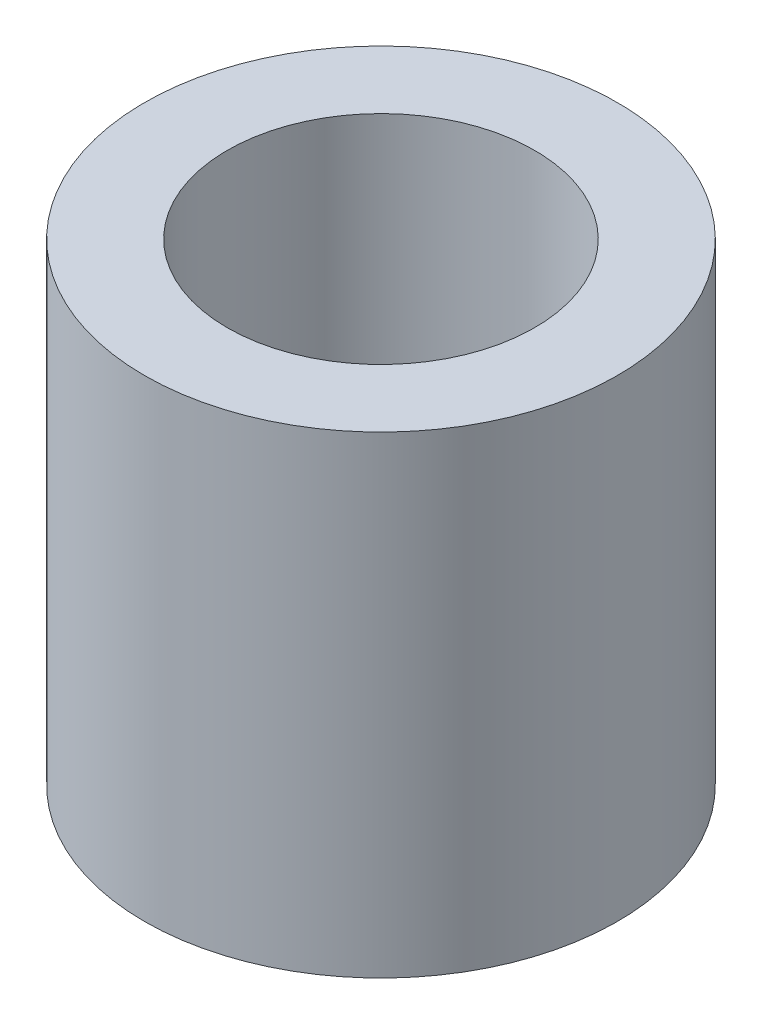
ISO-10303-21;
HEADER;
FILE_DESCRIPTION(('STEP AP214'),'2;1');
FILE_NAME('part.step','',(''),(''),'','','');
FILE_SCHEMA(('AUTOMOTIVE_DESIGN { 1 0 10303 214 1 1 1 1 }'));
ENDSEC;
DATA;
#1=APPLICATION_CONTEXT('core data for automotive mechanical design processes');
#2=APPLICATION_PROTOCOL_DEFINITION('international standard','automotive_design',2000,#1);
#3=PRODUCT_CONTEXT('',#1,'mechanical');
#4=PRODUCT('Part','Part','',(#3));
#5=PRODUCT_RELATED_PRODUCT_CATEGORY('part','',(#4));
#6=PRODUCT_DEFINITION_FORMATION('','',#4);
#7=PRODUCT_DEFINITION_CONTEXT('part definition',#1,'design');
#8=PRODUCT_DEFINITION('design','',#6,#7);
#9=PRODUCT_DEFINITION_SHAPE('','',#8);
#10=(LENGTH_UNIT() NAMED_UNIT(*) SI_UNIT(.MILLI.,.METRE.));
#11=(NAMED_UNIT(*) PLANE_ANGLE_UNIT() SI_UNIT($,.RADIAN.));
#12=(NAMED_UNIT(*) SI_UNIT($,.STERADIAN.) SOLID_ANGLE_UNIT());
#13=UNCERTAINTY_MEASURE_WITH_UNIT(LENGTH_MEASURE(1.E-05),#10,'distance_accuracy_value','');
#14=(GEOMETRIC_REPRESENTATION_CONTEXT(3) GLOBAL_UNCERTAINTY_ASSIGNED_CONTEXT((#13)) GLOBAL_UNIT_ASSIGNED_CONTEXT((#10,
#11,#12)) REPRESENTATION_CONTEXT('',''));
#15=CARTESIAN_POINT('',(0.,0.,0.));
#16=DIRECTION('',(0.,0.,1.));
#17=DIRECTION('',(1.,0.,0.));
#18=AXIS2_PLACEMENT_3D('',#15,#16,#17);
#19=CARTESIAN_POINT('',(0.,10.,0.));
#20=DIRECTION('',(0.,1.,0.));
#21=DIRECTION('',(0.,0.,1.));
#22=AXIS2_PLACEMENT_3D('',#19,#20,#21);
#23=PLANE('',#22);
#24=CARTESIAN_POINT('',(0.,10.,0.));
#25=DIRECTION('',(0.,1.,0.));
#26=DIRECTION('',(0.,0.,1.));
#27=AXIS2_PLACEMENT_3D('',#24,#25,#26);
#28=CIRCLE('',#27,5.);
#29=CARTESIAN_POINT('',(0.,10.,5.));
#30=VERTEX_POINT('',#29);
#31=EDGE_CURVE('E10',#30,#30,#28,.T.);
#32=ORIENTED_EDGE('',*,*,#31,.T.);
#33=EDGE_LOOP('',(#32));
#34=FACE_BOUND('',#33,.T.);
#35=CARTESIAN_POINT('',(0.,10.,0.));
#36=DIRECTION('',(0.,1.,0.));
#37=DIRECTION('',(0.,0.,1.));
#38=AXIS2_PLACEMENT_3D('',#35,#36,#37);
#39=CIRCLE('',#38,3.25);
#40=CARTESIAN_POINT('',(0.,10.,3.25));
#41=VERTEX_POINT('',#40);
#42=EDGE_CURVE('E52',#41,#41,#39,.T.);
#43=ORIENTED_EDGE('',*,*,#42,.F.);
#44=EDGE_LOOP('',(#43));
#45=FACE_BOUND('',#44,.T.);
#46=ADVANCED_FACE('F41',(#34,#45),#23,.T.);
#47=CARTESIAN_POINT('',(0.,0.,0.));
#48=DIRECTION('',(0.,1.,0.));
#49=DIRECTION('',(0.,0.,1.));
#50=AXIS2_PLACEMENT_3D('',#47,#48,#49);
#51=PLANE('',#50);
#52=CARTESIAN_POINT('',(0.,0.,0.));
#53=DIRECTION('',(0.,1.,0.));
#54=DIRECTION('',(0.,0.,1.));
#55=AXIS2_PLACEMENT_3D('',#52,#53,#54);
#56=CIRCLE('',#55,5.);
#57=CARTESIAN_POINT('',(0.,0.,5.));
#58=VERTEX_POINT('',#57);
#59=EDGE_CURVE('E45',#58,#58,#56,.T.);
#60=ORIENTED_EDGE('',*,*,#59,.F.);
#61=EDGE_LOOP('',(#60));
#62=FACE_BOUND('',#61,.T.);
#63=CARTESIAN_POINT('',(0.,0.,0.));
#64=DIRECTION('',(0.,1.,0.));
#65=DIRECTION('',(0.,0.,1.));
#66=AXIS2_PLACEMENT_3D('',#63,#64,#65);
#67=CIRCLE('',#66,3.25);
#68=CARTESIAN_POINT('',(0.,0.,3.25));
#69=VERTEX_POINT('',#68);
#70=EDGE_CURVE('E54',#69,#69,#67,.T.);
#71=ORIENTED_EDGE('',*,*,#70,.T.);
#72=EDGE_LOOP('',(#71));
#73=FACE_BOUND('',#72,.T.);
#74=ADVANCED_FACE('F64',(#62,#73),#51,.F.);
#75=CARTESIAN_POINT('',(0.,10.,0.));
#76=DIRECTION('',(0.,-1.,0.));
#77=DIRECTION('',(0.,0.,-1.));
#78=AXIS2_PLACEMENT_3D('',#75,#76,#77);
#79=CYLINDRICAL_SURFACE('',#78,5.);
#80=ORIENTED_EDGE('',*,*,#31,.F.);
#81=EDGE_LOOP('',(#80));
#82=FACE_BOUND('',#81,.T.);
#83=ORIENTED_EDGE('',*,*,#59,.T.);
#84=EDGE_LOOP('',(#83));
#85=FACE_BOUND('',#84,.T.);
#86=ADVANCED_FACE('F43',(#82,#85),#79,.T.);
#87=CARTESIAN_POINT('',(0.,10.,0.));
#88=DIRECTION('',(0.,-1.,0.));
#89=DIRECTION('',(0.,0.,-1.));
#90=AXIS2_PLACEMENT_3D('',#87,#88,#89);
#91=CYLINDRICAL_SURFACE('',#90,3.25);
#92=ORIENTED_EDGE('',*,*,#42,.T.);
#93=EDGE_LOOP('',(#92));
#94=FACE_BOUND('',#93,.T.);
#95=ORIENTED_EDGE('',*,*,#70,.F.);
#96=EDGE_LOOP('',(#95));
#97=FACE_BOUND('',#96,.T.);
#98=ADVANCED_FACE('F60',(#94,#97),#91,.F.);
#99=CLOSED_SHELL('',(#46,#74,#86,#98));
#100=MANIFOLD_SOLID_BREP('B2',#99);
#101=ADVANCED_BREP_SHAPE_REPRESENTATION('',(#18,#100),#14);
#102=SHAPE_DEFINITION_REPRESENTATION(#9,#101);
ENDSEC;
END-ISO-10303-21;
